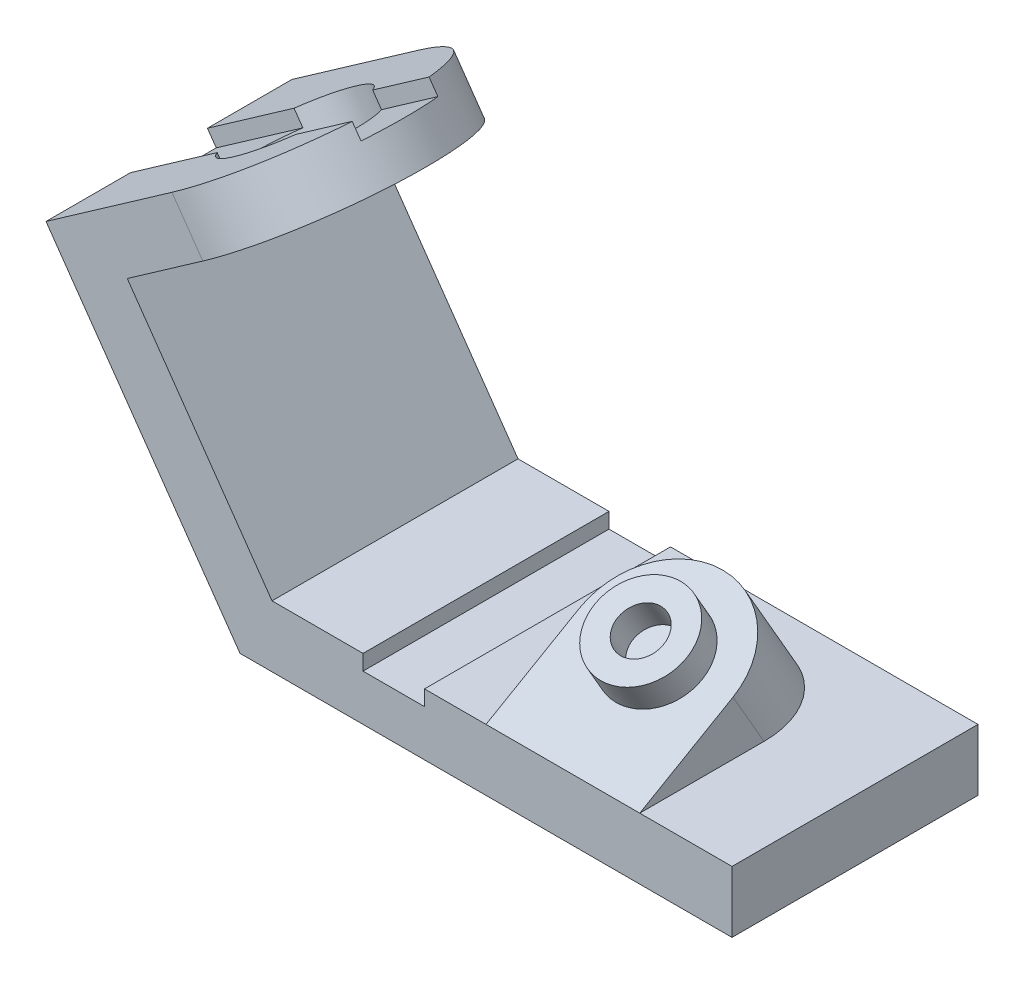
ISO-10303-21;
HEADER;
FILE_DESCRIPTION(('STEP AP214'),'2;1');
FILE_NAME('part.step','',(''),(''),'','','');
FILE_SCHEMA(('AUTOMOTIVE_DESIGN { 1 0 10303 214 1 1 1 1 }'));
ENDSEC;
DATA;
#1=APPLICATION_CONTEXT('core data for automotive mechanical design processes');
#2=APPLICATION_PROTOCOL_DEFINITION('international standard','automotive_design',2000,#1);
#3=PRODUCT_CONTEXT('',#1,'mechanical');
#4=PRODUCT('Part','Part','',(#3));
#5=PRODUCT_RELATED_PRODUCT_CATEGORY('part','',(#4));
#6=PRODUCT_DEFINITION_FORMATION('','',#4);
#7=PRODUCT_DEFINITION_CONTEXT('part definition',#1,'design');
#8=PRODUCT_DEFINITION('design','',#6,#7);
#9=PRODUCT_DEFINITION_SHAPE('','',#8);
#10=(LENGTH_UNIT() NAMED_UNIT(*) SI_UNIT(.MILLI.,.METRE.));
#11=(NAMED_UNIT(*) PLANE_ANGLE_UNIT() SI_UNIT($,.RADIAN.));
#12=(NAMED_UNIT(*) SI_UNIT($,.STERADIAN.) SOLID_ANGLE_UNIT());
#13=UNCERTAINTY_MEASURE_WITH_UNIT(LENGTH_MEASURE(1.E-05),#10,'distance_accuracy_value','');
#14=(GEOMETRIC_REPRESENTATION_CONTEXT(3) GLOBAL_UNCERTAINTY_ASSIGNED_CONTEXT((#13)) GLOBAL_UNIT_ASSIGNED_CONTEXT((#10,
#11,#12)) REPRESENTATION_CONTEXT('',''));
#15=CARTESIAN_POINT('',(0.,0.,0.));
#16=DIRECTION('',(0.,0.,1.));
#17=DIRECTION('',(1.,0.,0.));
#18=AXIS2_PLACEMENT_3D('',#15,#16,#17);
#19=CARTESIAN_POINT('',(-283.328628158242,114.435540587172,-101.6));
#20=DIRECTION('',(-0.57357643635105,0.819152044288989,0.));
#21=DIRECTION('',(-0.819152044288989,-0.57357643635105,0.));
#22=AXIS2_PLACEMENT_3D('',#19,#20,#21);
#23=PLANE('',#22);
#24=DIRECTION('',(-0.819152044288989,-0.57357643635105,0.));
#25=VECTOR('',#24,1.);
#26=CARTESIAN_POINT('',(-146.979381596355,209.90831085902,-66.675));
#27=LINE('',#26,#25);
#28=CARTESIAN_POINT('',(-191.783617952083,178.536046819009,-66.675));
#29=VERTEX_POINT('',#28);
#30=CARTESIAN_POINT('',(-215.070434211515,162.230442533251,-66.675));
#31=VERTEX_POINT('',#30);
#32=EDGE_CURVE('E206',#29,#31,#27,.T.);
#33=ORIENTED_EDGE('',*,*,#32,.F.);
#34=CARTESIAN_POINT('',(-231.312473345891,150.857644295464,-50.8));
#35=DIRECTION('',(-0.57357643635105,0.819152044288989,0.));
#36=DIRECTION('',(0.819152044288989,0.57357643635105,0.));
#37=AXIS2_PLACEMENT_3D('',#34,#35,#36);
#38=CIRCLE('',#37,50.8);
#39=CARTESIAN_POINT('',(-231.312473345891,150.857644295464,-101.6));
#40=VERTEX_POINT('',#39);
#41=EDGE_CURVE('E253',#29,#40,#38,.T.);
#42=ORIENTED_EDGE('',*,*,#41,.T.);
#43=DIRECTION('',(-0.819152044288989,-0.57357643635105,0.));
#44=VECTOR('',#43,1.);
#45=CARTESIAN_POINT('',(-283.328628158242,114.435540587172,-101.6));
#46=LINE('',#45,#44);
#47=CARTESIAN_POINT('',(-283.328628158242,114.435540587172,-101.6));
#48=VERTEX_POINT('',#47);
#49=EDGE_CURVE('E275',#40,#48,#46,.T.);
#50=ORIENTED_EDGE('',*,*,#49,.T.);
#51=DIRECTION('',(0.,0.,1.));
#52=VECTOR('',#51,1.);
#53=CARTESIAN_POINT('',(-283.328628158242,114.435540587172,-101.6));
#54=LINE('',#53,#52);
#55=CARTESIAN_POINT('',(-283.328628158242,114.435540587172,-66.675));
#56=VERTEX_POINT('',#55);
#57=EDGE_CURVE('E288',#48,#56,#54,.T.);
#58=ORIENTED_EDGE('',*,*,#57,.T.);
#59=DIRECTION('',(-0.819152044288989,-0.57357643635105,0.));
#60=VECTOR('',#59,1.);
#61=CARTESIAN_POINT('',(-146.979381596355,209.90831085902,-66.675));
#62=LINE('',#61,#60);
#63=CARTESIAN_POINT('',(-247.554512480267,139.484846057676,-66.675));
#64=VERTEX_POINT('',#63);
#65=EDGE_CURVE('E222',#64,#56,#62,.T.);
#66=ORIENTED_EDGE('',*,*,#65,.F.);
#67=CARTESIAN_POINT('',(-231.312473345891,150.857644295464,-50.8));
#68=DIRECTION('',(-0.57357643635105,0.819152044288989,0.));
#69=DIRECTION('',(-0.819152044288989,-0.57357643635105,0.));
#70=AXIS2_PLACEMENT_3D('',#67,#68,#69);
#71=CIRCLE('',#70,25.4);
#72=EDGE_CURVE('E249',#31,#64,#71,.T.);
#73=ORIENTED_EDGE('',*,*,#72,.F.);
#74=EDGE_LOOP('',(#33,#42,#50,#58,#66,#73));
#75=FACE_BOUND('',#74,.T.);
#76=ADVANCED_FACE('F36',(#75),#23,.T.);
#77=CARTESIAN_POINT('',(0.,25.4,-101.6));
#78=DIRECTION('',(0.,1.,0.));
#79=DIRECTION('',(-1.,0.,0.));
#80=AXIS2_PLACEMENT_3D('',#77,#78,#79);
#81=PLANE('',#80);
#82=DIRECTION('',(0.,0.,-1.));
#83=VECTOR('',#82,1.);
#84=CARTESIAN_POINT('',(-189.977596915986,25.4,-101.6));
#85=LINE('',#84,#83);
#86=CARTESIAN_POINT('',(-189.977596915986,25.4,0.));
#87=VERTEX_POINT('',#86);
#88=CARTESIAN_POINT('',(-189.977596915986,25.4,-101.6));
#89=VERTEX_POINT('',#88);
#90=EDGE_CURVE('E291',#87,#89,#85,.T.);
#91=ORIENTED_EDGE('',*,*,#90,.F.);
#92=DIRECTION('',(-1.,0.,0.));
#93=VECTOR('',#92,1.);
#94=CARTESIAN_POINT('',(0.,25.4,0.));
#95=LINE('',#94,#93);
#96=CARTESIAN_POINT('',(-152.4,25.4,0.));
#97=VERTEX_POINT('',#96);
#98=EDGE_CURVE('E365',#97,#87,#95,.T.);
#99=ORIENTED_EDGE('',*,*,#98,.F.);
#100=DIRECTION('',(0.,0.,1.));
#101=VECTOR('',#100,1.);
#102=CARTESIAN_POINT('',(-152.4,25.4,-101.6));
#103=LINE('',#102,#101);
#104=CARTESIAN_POINT('',(-152.4,25.4,-101.6));
#105=VERTEX_POINT('',#104);
#106=EDGE_CURVE('E341',#105,#97,#103,.T.);
#107=ORIENTED_EDGE('',*,*,#106,.F.);
#108=DIRECTION('',(-1.,0.,0.));
#109=VECTOR('',#108,1.);
#110=CARTESIAN_POINT('',(0.,25.4,-101.6));
#111=LINE('',#110,#109);
#112=EDGE_CURVE('E354',#105,#89,#111,.T.);
#113=ORIENTED_EDGE('',*,*,#112,.T.);
#114=EDGE_LOOP('',(#91,#99,#107,#113));
#115=FACE_BOUND('',#114,.T.);
#116=ADVANCED_FACE('F405',(#115),#81,.T.);
#117=DIRECTION('',(0.,0.,-1.));
#118=VECTOR('',#117,1.);
#119=CARTESIAN_POINT('',(-101.6,25.4,-25.4010000000001));
#120=LINE('',#119,#118);
#121=CARTESIAN_POINT('',(-101.6,25.4,0.));
#122=VERTEX_POINT('',#121);
#123=CARTESIAN_POINT('',(-101.6,25.4,-51.3264389309578));
#124=VERTEX_POINT('',#123);
#125=EDGE_CURVE('E317',#122,#124,#120,.T.);
#126=ORIENTED_EDGE('',*,*,#125,.T.);
#127=CARTESIAN_POINT('',(-69.85,25.4,-51.3264389309578));
#128=DIRECTION('',(0.,1.,0.));
#129=DIRECTION('',(0.,0.,1.));
#130=AXIS2_PLACEMENT_3D('',#127,#128,#129);
#131=ELLIPSE('',#130,36.6617420935412,31.75);
#132=CARTESIAN_POINT('',(-38.1,25.4,-51.3264389309578));
#133=VERTEX_POINT('',#132);
#134=EDGE_CURVE('E321',#124,#133,#131,.F.);
#135=ORIENTED_EDGE('',*,*,#134,.T.);
#136=DIRECTION('',(0.,0.,1.));
#137=VECTOR('',#136,1.);
#138=CARTESIAN_POINT('',(-38.1,25.4,-25.4010000000001));
#139=LINE('',#138,#137);
#140=CARTESIAN_POINT('',(-38.1,25.4,0.));
#141=VERTEX_POINT('',#140);
#142=EDGE_CURVE('E316',#133,#141,#139,.T.);
#143=ORIENTED_EDGE('',*,*,#142,.T.);
#144=CARTESIAN_POINT('',(0.,25.4,0.));
#145=VERTEX_POINT('',#144);
#146=EDGE_CURVE('E366',#145,#141,#95,.T.);
#147=ORIENTED_EDGE('',*,*,#146,.F.);
#148=DIRECTION('',(0.,0.,1.));
#149=VECTOR('',#148,1.);
#150=CARTESIAN_POINT('',(0.,25.4,-101.6));
#151=LINE('',#150,#149);
#152=CARTESIAN_POINT('',(0.,25.4,-101.6));
#153=VERTEX_POINT('',#152);
#154=EDGE_CURVE('E362',#153,#145,#151,.T.);
#155=ORIENTED_EDGE('',*,*,#154,.F.);
#156=CARTESIAN_POINT('',(-127.,25.4,-101.6));
#157=VERTEX_POINT('',#156);
#158=EDGE_CURVE('E356',#153,#157,#111,.T.);
#159=ORIENTED_EDGE('',*,*,#158,.T.);
#160=DIRECTION('',(0.,0.,1.));
#161=VECTOR('',#160,1.);
#162=CARTESIAN_POINT('',(-127.,25.4,-101.6));
#163=LINE('',#162,#161);
#164=CARTESIAN_POINT('',(-127.,25.4,0.));
#165=VERTEX_POINT('',#164);
#166=EDGE_CURVE('E344',#157,#165,#163,.T.);
#167=ORIENTED_EDGE('',*,*,#166,.T.);
#168=EDGE_CURVE('E369',#122,#165,#95,.T.);
#169=ORIENTED_EDGE('',*,*,#168,.F.);
#170=EDGE_LOOP('',(#126,#135,#143,#147,#155,#159,#167,#169));
#171=FACE_BOUND('',#170,.T.);
#172=ADVANCED_FACE('F411',(#171),#81,.T.);
#173=CARTESIAN_POINT('',(0.,0.,-101.6));
#174=DIRECTION('',(0.,0.,1.));
#175=DIRECTION('',(1.,0.,0.));
#176=AXIS2_PLACEMENT_3D('',#173,#174,#175);
#177=PLANE('',#176);
#178=DIRECTION('',(1.,0.,0.));
#179=VECTOR('',#178,1.);
#180=CARTESIAN_POINT('',(0.,0.,-101.6));
#181=LINE('',#180,#179);
#182=CARTESIAN_POINT('',(-203.2,0.,-101.6));
#183=VERTEX_POINT('',#182);
#184=CARTESIAN_POINT('',(0.,0.,-101.6));
#185=VERTEX_POINT('',#184);
#186=EDGE_CURVE('E359',#183,#185,#181,.T.);
#187=ORIENTED_EDGE('',*,*,#186,.F.);
#188=DIRECTION('',(0.57357643635105,-0.819152044288989,0.));
#189=VECTOR('',#188,1.);
#190=CARTESIAN_POINT('',(-203.2,0.,-101.6));
#191=LINE('',#190,#189);
#192=EDGE_CURVE('E279',#48,#183,#191,.T.);
#193=ORIENTED_EDGE('',*,*,#192,.F.);
#194=ORIENTED_EDGE('',*,*,#49,.F.);
#195=DIRECTION('',(-0.57357643635105,0.819152044288989,0.));
#196=VECTOR('',#195,1.);
#197=CARTESIAN_POINT('',(-218.564737047989,132.651990111141,-101.6));
#198=LINE('',#197,#196);
#199=CARTESIAN_POINT('',(-218.564737047989,132.651990111141,-101.6));
#200=VERTEX_POINT('',#199);
#201=EDGE_CURVE('E267',#200,#40,#198,.T.);
#202=ORIENTED_EDGE('',*,*,#201,.F.);
#203=DIRECTION('',(-0.819152044288989,-0.57357643635105,0.));
#204=VECTOR('',#203,1.);
#205=CARTESIAN_POINT('',(-270.58089186034,96.229886402849,-101.6));
#206=LINE('',#205,#204);
#207=CARTESIAN_POINT('',(-249.774429935399,110.798727886166,-101.6));
#208=VERTEX_POINT('',#207);
#209=EDGE_CURVE('E261',#200,#208,#206,.T.);
#210=ORIENTED_EDGE('',*,*,#209,.T.);
#211=DIRECTION('',(-0.57357643635105,0.819152044288989,0.));
#212=VECTOR('',#211,1.);
#213=CARTESIAN_POINT('',(-262.522166233301,129.004382070488,-101.6));
#214=LINE('',#213,#212);
#215=EDGE_CURVE('E273',#89,#208,#214,.T.);
#216=ORIENTED_EDGE('',*,*,#215,.F.);
#217=ORIENTED_EDGE('',*,*,#112,.F.);
#218=DIRECTION('',(0.,1.,0.));
#219=VECTOR('',#218,1.);
#220=CARTESIAN_POINT('',(-152.4,0.,-101.6));
#221=LINE('',#220,#219);
#222=CARTESIAN_POINT('',(-152.4,19.05,-101.6));
#223=VERTEX_POINT('',#222);
#224=EDGE_CURVE('E326',#223,#105,#221,.T.);
#225=ORIENTED_EDGE('',*,*,#224,.F.);
#226=DIRECTION('',(-1.,0.,0.));
#227=VECTOR('',#226,1.);
#228=CARTESIAN_POINT('',(0.,19.05,-101.6));
#229=LINE('',#228,#227);
#230=CARTESIAN_POINT('',(-127.,19.05,-101.6));
#231=VERTEX_POINT('',#230);
#232=EDGE_CURVE('E328',#231,#223,#229,.T.);
#233=ORIENTED_EDGE('',*,*,#232,.F.);
#234=DIRECTION('',(0.,-1.,0.));
#235=VECTOR('',#234,1.);
#236=CARTESIAN_POINT('',(-127.,0.,-101.6));
#237=LINE('',#236,#235);
#238=EDGE_CURVE('E331',#157,#231,#237,.T.);
#239=ORIENTED_EDGE('',*,*,#238,.F.);
#240=ORIENTED_EDGE('',*,*,#158,.F.);
#241=DIRECTION('',(0.,1.,0.));
#242=VECTOR('',#241,1.);
#243=CARTESIAN_POINT('',(0.,0.,-101.6));
#244=LINE('',#243,#242);
#245=EDGE_CURVE('E351',#185,#153,#244,.T.);
#246=ORIENTED_EDGE('',*,*,#245,.F.);
#247=EDGE_LOOP('',(#187,#193,#194,#202,#210,#216,#217,#225,#233,#239,#240,#246));
#248=FACE_BOUND('',#247,.T.);
#249=ADVANCED_FACE('F443',(#248),#177,.F.);
#250=CARTESIAN_POINT('',(0.,0.,0.));
#251=DIRECTION('',(0.,0.,1.));
#252=DIRECTION('',(1.,0.,0.));
#253=AXIS2_PLACEMENT_3D('',#250,#251,#252);
#254=PLANE('',#253);
#255=DIRECTION('',(-0.57357643635105,0.819152044288989,0.));
#256=VECTOR('',#255,1.);
#257=CARTESIAN_POINT('',(-262.522166233301,129.004382070488,0.));
#258=LINE('',#257,#256);
#259=CARTESIAN_POINT('',(-249.774429935399,110.798727886166,0.));
#260=VERTEX_POINT('',#259);
#261=EDGE_CURVE('E270',#87,#260,#258,.T.);
#262=ORIENTED_EDGE('',*,*,#261,.T.);
#263=DIRECTION('',(0.819152044288989,0.57357643635105,0.));
#264=VECTOR('',#263,1.);
#265=CARTESIAN_POINT('',(-270.58089186034,96.229886402849,0.));
#266=LINE('',#265,#264);
#267=CARTESIAN_POINT('',(-218.564737047989,132.651990111141,0.));
#268=VERTEX_POINT('',#267);
#269=EDGE_CURVE('E255',#260,#268,#266,.T.);
#270=ORIENTED_EDGE('',*,*,#269,.T.);
#271=DIRECTION('',(-0.57357643635105,0.819152044288989,0.));
#272=VECTOR('',#271,1.);
#273=CARTESIAN_POINT('',(-218.564737047989,132.651990111141,0.));
#274=LINE('',#273,#272);
#275=CARTESIAN_POINT('',(-231.312473345891,150.857644295464,0.));
#276=VERTEX_POINT('',#275);
#277=EDGE_CURVE('E264',#268,#276,#274,.T.);
#278=ORIENTED_EDGE('',*,*,#277,.T.);
#279=DIRECTION('',(-0.819152044288989,-0.57357643635105,0.));
#280=VECTOR('',#279,1.);
#281=CARTESIAN_POINT('',(-283.328628158242,114.435540587172,0.));
#282=LINE('',#281,#280);
#283=CARTESIAN_POINT('',(-283.328628158242,114.435540587172,0.));
#284=VERTEX_POINT('',#283);
#285=EDGE_CURVE('E284',#276,#284,#282,.T.);
#286=ORIENTED_EDGE('',*,*,#285,.T.);
#287=DIRECTION('',(0.57357643635105,-0.819152044288989,0.));
#288=VECTOR('',#287,1.);
#289=CARTESIAN_POINT('',(-203.2,0.,0.));
#290=LINE('',#289,#288);
#291=CARTESIAN_POINT('',(-203.2,0.,0.));
#292=VERTEX_POINT('',#291);
#293=EDGE_CURVE('E276',#284,#292,#290,.T.);
#294=ORIENTED_EDGE('',*,*,#293,.T.);
#295=DIRECTION('',(1.,0.,0.));
#296=VECTOR('',#295,1.);
#297=CARTESIAN_POINT('',(0.,0.,0.));
#298=LINE('',#297,#296);
#299=CARTESIAN_POINT('',(0.,0.,0.));
#300=VERTEX_POINT('',#299);
#301=EDGE_CURVE('E355',#292,#300,#298,.T.);
#302=ORIENTED_EDGE('',*,*,#301,.T.);
#303=DIRECTION('',(0.,1.,0.));
#304=VECTOR('',#303,1.);
#305=CARTESIAN_POINT('',(0.,0.,0.));
#306=LINE('',#305,#304);
#307=EDGE_CURVE('E343',#300,#145,#306,.T.);
#308=ORIENTED_EDGE('',*,*,#307,.T.);
#309=ORIENTED_EDGE('',*,*,#146,.T.);
#310=DIRECTION('',(1.,0.,0.));
#311=VECTOR('',#310,1.);
#312=CARTESIAN_POINT('',(0.,25.4,0.));
#313=LINE('',#312,#311);
#314=EDGE_CURVE('E310',#122,#141,#313,.T.);
#315=ORIENTED_EDGE('',*,*,#314,.F.);
#316=ORIENTED_EDGE('',*,*,#168,.T.);
#317=DIRECTION('',(0.,-1.,0.));
#318=VECTOR('',#317,1.);
#319=CARTESIAN_POINT('',(-127.,0.,0.));
#320=LINE('',#319,#318);
#321=CARTESIAN_POINT('',(-127.,19.05,0.));
#322=VERTEX_POINT('',#321);
#323=EDGE_CURVE('E329',#165,#322,#320,.T.);
#324=ORIENTED_EDGE('',*,*,#323,.T.);
#325=DIRECTION('',(-1.,0.,0.));
#326=VECTOR('',#325,1.);
#327=CARTESIAN_POINT('',(0.,19.05,0.));
#328=LINE('',#327,#326);
#329=CARTESIAN_POINT('',(-152.4,19.05,0.));
#330=VERTEX_POINT('',#329);
#331=EDGE_CURVE('E336',#322,#330,#328,.T.);
#332=ORIENTED_EDGE('',*,*,#331,.T.);
#333=DIRECTION('',(0.,1.,0.));
#334=VECTOR('',#333,1.);
#335=CARTESIAN_POINT('',(-152.4,0.,0.));
#336=LINE('',#335,#334);
#337=EDGE_CURVE('E320',#330,#97,#336,.T.);
#338=ORIENTED_EDGE('',*,*,#337,.T.);
#339=ORIENTED_EDGE('',*,*,#98,.T.);
#340=EDGE_LOOP('',(#262,#270,#278,#286,#294,#302,#308,#309,#315,#316,#324,#332,#338,#339));
#341=FACE_BOUND('',#340,.T.);
#342=ADVANCED_FACE('F461',(#341),#254,.T.);
#343=CARTESIAN_POINT('',(0.,0.,-101.6));
#344=DIRECTION('',(1.,0.,0.));
#345=DIRECTION('',(0.,0.,-1.));
#346=AXIS2_PLACEMENT_3D('',#343,#344,#345);
#347=PLANE('',#346);
#348=ORIENTED_EDGE('',*,*,#307,.F.);
#349=DIRECTION('',(0.,0.,1.));
#350=VECTOR('',#349,1.);
#351=CARTESIAN_POINT('',(0.,0.,-101.6));
#352=LINE('',#351,#350);
#353=EDGE_CURVE('E372',#185,#300,#352,.T.);
#354=ORIENTED_EDGE('',*,*,#353,.F.);
#355=ORIENTED_EDGE('',*,*,#245,.T.);
#356=ORIENTED_EDGE('',*,*,#154,.T.);
#357=EDGE_LOOP('',(#348,#354,#355,#356));
#358=FACE_BOUND('',#357,.T.);
#359=ADVANCED_FACE('F38',(#358),#347,.T.);
#360=CARTESIAN_POINT('',(0.,0.,-101.6));
#361=DIRECTION('',(0.,-1.,0.));
#362=DIRECTION('',(0.,0.,-1.));
#363=AXIS2_PLACEMENT_3D('',#360,#361,#362);
#364=PLANE('',#363);
#365=ORIENTED_EDGE('',*,*,#301,.F.);
#366=DIRECTION('',(0.,0.,1.));
#367=VECTOR('',#366,1.);
#368=CARTESIAN_POINT('',(-203.2,0.,-101.6));
#369=LINE('',#368,#367);
#370=EDGE_CURVE('E374',#183,#292,#369,.T.);
#371=ORIENTED_EDGE('',*,*,#370,.F.);
#372=ORIENTED_EDGE('',*,*,#186,.T.);
#373=ORIENTED_EDGE('',*,*,#353,.T.);
#374=EDGE_LOOP('',(#365,#371,#372,#373));
#375=FACE_BOUND('',#374,.T.);
#376=ADVANCED_FACE('F485',(#375),#364,.T.);
#377=CARTESIAN_POINT('',(-152.4,0.,-101.6));
#378=DIRECTION('',(1.,0.,0.));
#379=DIRECTION('',(0.,0.,-1.));
#380=AXIS2_PLACEMENT_3D('',#377,#378,#379);
#381=PLANE('',#380);
#382=ORIENTED_EDGE('',*,*,#337,.F.);
#383=DIRECTION('',(0.,0.,1.));
#384=VECTOR('',#383,1.);
#385=CARTESIAN_POINT('',(-152.4,19.05,-101.6));
#386=LINE('',#385,#384);
#387=EDGE_CURVE('E333',#223,#330,#386,.T.);
#388=ORIENTED_EDGE('',*,*,#387,.F.);
#389=ORIENTED_EDGE('',*,*,#224,.T.);
#390=ORIENTED_EDGE('',*,*,#106,.T.);
#391=EDGE_LOOP('',(#382,#388,#389,#390));
#392=FACE_BOUND('',#391,.T.);
#393=ADVANCED_FACE('F487',(#392),#381,.T.);
#394=CARTESIAN_POINT('',(-127.,0.,-101.6));
#395=DIRECTION('',(-1.,0.,0.));
#396=DIRECTION('',(0.,0.,1.));
#397=AXIS2_PLACEMENT_3D('',#394,#395,#396);
#398=PLANE('',#397);
#399=ORIENTED_EDGE('',*,*,#323,.F.);
#400=ORIENTED_EDGE('',*,*,#166,.F.);
#401=ORIENTED_EDGE('',*,*,#238,.T.);
#402=DIRECTION('',(0.,0.,1.));
#403=VECTOR('',#402,1.);
#404=CARTESIAN_POINT('',(-127.,19.05,-101.6));
#405=LINE('',#404,#403);
#406=EDGE_CURVE('E347',#231,#322,#405,.T.);
#407=ORIENTED_EDGE('',*,*,#406,.T.);
#408=EDGE_LOOP('',(#399,#400,#401,#407));
#409=FACE_BOUND('',#408,.T.);
#410=ADVANCED_FACE('F474',(#409),#398,.T.);
#411=CARTESIAN_POINT('',(0.,19.05,-101.6));
#412=DIRECTION('',(0.,1.,0.));
#413=DIRECTION('',(-1.,0.,0.));
#414=AXIS2_PLACEMENT_3D('',#411,#412,#413);
#415=PLANE('',#414);
#416=ORIENTED_EDGE('',*,*,#331,.F.);
#417=ORIENTED_EDGE('',*,*,#406,.F.);
#418=ORIENTED_EDGE('',*,*,#232,.T.);
#419=ORIENTED_EDGE('',*,*,#387,.T.);
#420=EDGE_LOOP('',(#416,#417,#418,#419));
#421=FACE_BOUND('',#420,.T.);
#422=ADVANCED_FACE('F403',(#421),#415,.T.);
#423=CARTESIAN_POINT('',(-101.6,-43.9958225630571,-25.4010000000001));
#424=DIRECTION('',(-1.,0.,0.));
#425=DIRECTION('',(0.,0.,1.));
#426=AXIS2_PLACEMENT_3D('',#423,#424,#425);
#427=PLANE('',#426);
#428=ORIENTED_EDGE('',*,*,#125,.F.);
#429=DIRECTION('',(0.,-0.500000000000001,0.866025403784438));
#430=VECTOR('',#429,1.);
#431=CARTESIAN_POINT('',(-101.6,19.05,10.9985226280624));
#432=LINE('',#431,#430);
#433=CARTESIAN_POINT('',(-101.6,47.625,-38.4948291982183));
#434=VERTEX_POINT('',#433);
#435=EDGE_CURVE('E308',#434,#122,#432,.T.);
#436=ORIENTED_EDGE('',*,*,#435,.F.);
#437=DIRECTION('',(0.,0.866025403784438,0.500000000000001));
#438=VECTOR('',#437,1.);
#439=CARTESIAN_POINT('',(-101.6,-15.420822563057,-74.8943518262808));
#440=LINE('',#439,#438);
#441=EDGE_CURVE('E312',#124,#434,#440,.T.);
#442=ORIENTED_EDGE('',*,*,#441,.F.);
#443=EDGE_LOOP('',(#428,#436,#442));
#444=FACE_BOUND('',#443,.T.);
#445=ADVANCED_FACE('F502',(#444),#427,.T.);
#446=CARTESIAN_POINT('',(-69.85,-15.420822563057,-74.8943518262808));
#447=DIRECTION('',(0.,0.866025403784438,0.500000000000001));
#448=DIRECTION('',(0.,-0.500000000000001,0.866025403784438));
#449=AXIS2_PLACEMENT_3D('',#446,#447,#448);
#450=CYLINDRICAL_SURFACE('',#449,31.75);
#451=ORIENTED_EDGE('',*,*,#134,.F.);
#452=ORIENTED_EDGE('',*,*,#441,.T.);
#453=CARTESIAN_POINT('',(-69.85,47.6250000000001,-38.4948291982183));
#454=DIRECTION('',(0.,0.866025403784438,0.500000000000001));
#455=DIRECTION('',(0.,-0.500000000000001,0.866025403784438));
#456=AXIS2_PLACEMENT_3D('',#453,#454,#455);
#457=CIRCLE('',#456,31.75);
#458=CARTESIAN_POINT('',(-38.1,47.6250000000001,-38.4948291982183));
#459=VERTEX_POINT('',#458);
#460=EDGE_CURVE('E305',#459,#434,#457,.T.);
#461=ORIENTED_EDGE('',*,*,#460,.F.);
#462=DIRECTION('',(0.,0.866025403784438,0.500000000000001));
#463=VECTOR('',#462,1.);
#464=CARTESIAN_POINT('',(-38.1,-15.420822563057,-74.8943518262808));
#465=LINE('',#464,#463);
#466=EDGE_CURVE('E314',#133,#459,#465,.T.);
#467=ORIENTED_EDGE('',*,*,#466,.F.);
#468=EDGE_LOOP('',(#451,#452,#461,#467));
#469=FACE_BOUND('',#468,.T.);
#470=ADVANCED_FACE('F508',(#469),#450,.T.);
#471=CARTESIAN_POINT('',(-38.1,-43.9958225630571,-25.4010000000001));
#472=DIRECTION('',(1.,0.,0.));
#473=DIRECTION('',(0.,1.,0.));
#474=AXIS2_PLACEMENT_3D('',#471,#472,#473);
#475=PLANE('',#474);
#476=ORIENTED_EDGE('',*,*,#142,.F.);
#477=ORIENTED_EDGE('',*,*,#466,.T.);
#478=DIRECTION('',(0.,0.500000000000001,-0.866025403784438));
#479=VECTOR('',#478,1.);
#480=CARTESIAN_POINT('',(-38.1,19.05,10.9985226280624));
#481=LINE('',#480,#479);
#482=EDGE_CURVE('E300',#141,#459,#481,.T.);
#483=ORIENTED_EDGE('',*,*,#482,.F.);
#484=EDGE_LOOP('',(#476,#477,#483));
#485=FACE_BOUND('',#484,.T.);
#486=ADVANCED_FACE('F401',(#485),#475,.T.);
#487=CARTESIAN_POINT('',(0.,19.05,10.9985226280624));
#488=DIRECTION('',(0.,0.866025403784438,0.500000000000001));
#489=DIRECTION('',(0.,-0.500000000000001,0.866025403784438));
#490=AXIS2_PLACEMENT_3D('',#487,#488,#489);
#491=PLANE('',#490);
#492=CARTESIAN_POINT('',(-69.85,47.6250000000001,-38.4948291982183));
#493=DIRECTION('',(0.,0.866025403784438,0.500000000000001));
#494=DIRECTION('',(0.,-0.500000000000001,0.866025403784438));
#495=AXIS2_PLACEMENT_3D('',#492,#493,#494);
#496=CIRCLE('',#495,19.05);
#497=CARTESIAN_POINT('',(-69.85,38.1000000000001,-21.9970452561247));
#498=VERTEX_POINT('',#497);
#499=EDGE_CURVE('E296',#498,#498,#496,.T.);
#500=ORIENTED_EDGE('',*,*,#499,.F.);
#501=EDGE_LOOP('',(#500));
#502=FACE_BOUND('',#501,.T.);
#503=ORIENTED_EDGE('',*,*,#482,.T.);
#504=ORIENTED_EDGE('',*,*,#460,.T.);
#505=ORIENTED_EDGE('',*,*,#435,.T.);
#506=ORIENTED_EDGE('',*,*,#314,.T.);
#507=EDGE_LOOP('',(#503,#504,#505,#506));
#508=FACE_BOUND('',#507,.T.);
#509=ADVANCED_FACE('F386',(#502,#508),#491,.T.);
#510=CARTESIAN_POINT('',(-69.85,58.6235226280624,-32.1448291982183));
#511=DIRECTION('',(0.,0.866025403784438,0.500000000000001));
#512=DIRECTION('',(0.,-0.500000000000001,0.866025403784438));
#513=AXIS2_PLACEMENT_3D('',#510,#511,#512);
#514=PLANE('',#513);
#515=CARTESIAN_POINT('',(-69.85,58.6235226280624,-32.1448291982183));
#516=DIRECTION('',(0.,0.866025403784438,0.500000000000001));
#517=DIRECTION('',(0.,-0.500000000000001,0.866025403784438));
#518=AXIS2_PLACEMENT_3D('',#515,#516,#517);
#519=CIRCLE('',#518,19.05);
#520=CARTESIAN_POINT('',(-69.85,49.0985226280624,-15.6470452561247));
#521=VERTEX_POINT('',#520);
#522=EDGE_CURVE('E297',#521,#521,#519,.T.);
#523=ORIENTED_EDGE('',*,*,#522,.T.);
#524=EDGE_LOOP('',(#523));
#525=FACE_BOUND('',#524,.T.);
#526=CARTESIAN_POINT('',(-69.85,58.6235226280624,-32.1448291982183));
#527=DIRECTION('',(0.,0.866025403784438,0.500000000000001));
#528=DIRECTION('',(0.,-0.500000000000001,0.866025403784438));
#529=AXIS2_PLACEMENT_3D('',#526,#527,#528);
#530=CIRCLE('',#529,9.525);
#531=CARTESIAN_POINT('',(-69.85,53.8610226280624,-23.8959372271715));
#532=VERTEX_POINT('',#531);
#533=EDGE_CURVE('E293',#532,#532,#530,.T.);
#534=ORIENTED_EDGE('',*,*,#533,.F.);
#535=EDGE_LOOP('',(#534));
#536=FACE_BOUND('',#535,.T.);
#537=ADVANCED_FACE('F400',(#525,#536),#514,.T.);
#538=CARTESIAN_POINT('',(-69.85,58.6235226280624,-32.1448291982183));
#539=DIRECTION('',(0.,-0.866025403784438,-0.500000000000001));
#540=DIRECTION('',(0.,0.500000000000001,-0.866025403784438));
#541=AXIS2_PLACEMENT_3D('',#538,#539,#540);
#542=CYLINDRICAL_SURFACE('',#541,19.05);
#543=ORIENTED_EDGE('',*,*,#522,.F.);
#544=EDGE_LOOP('',(#543));
#545=FACE_BOUND('',#544,.T.);
#546=ORIENTED_EDGE('',*,*,#499,.T.);
#547=EDGE_LOOP('',(#546));
#548=FACE_BOUND('',#547,.T.);
#549=ADVANCED_FACE('F394',(#545,#548),#542,.T.);
#550=CARTESIAN_POINT('',(-69.85,58.6235226280624,-32.1448291982183));
#551=DIRECTION('',(0.,-0.866025403784438,-0.500000000000001));
#552=DIRECTION('',(0.,0.500000000000001,-0.866025403784438));
#553=AXIS2_PLACEMENT_3D('',#550,#551,#552);
#554=CYLINDRICAL_SURFACE('',#553,9.525);
#555=ORIENTED_EDGE('',*,*,#533,.T.);
#556=EDGE_LOOP('',(#555));
#557=FACE_BOUND('',#556,.T.);
#558=CARTESIAN_POINT('',(-69.85,47.6250000000001,-38.4948291982183));
#559=DIRECTION('',(0.,0.866025403784438,0.500000000000001));
#560=DIRECTION('',(0.,-0.500000000000001,0.866025403784438));
#561=AXIS2_PLACEMENT_3D('',#558,#559,#560);
#562=CIRCLE('',#561,9.525);
#563=CARTESIAN_POINT('',(-69.85,42.8625,-30.2459372271715));
#564=VERTEX_POINT('',#563);
#565=EDGE_CURVE('E44',#564,#564,#562,.F.);
#566=ORIENTED_EDGE('',*,*,#565,.T.);
#567=EDGE_LOOP('',(#566));
#568=FACE_BOUND('',#567,.T.);
#569=ADVANCED_FACE('F380',(#557,#568),#554,.F.);
#570=ORIENTED_EDGE('',*,*,#565,.F.);
#571=EDGE_LOOP('',(#570));
#572=FACE_BOUND('',#571,.T.);
#573=ADVANCED_FACE('F382',(#572),#491,.T.);
#574=CARTESIAN_POINT('',(-203.2,0.,-101.6));
#575=DIRECTION('',(-0.819152044288989,-0.57357643635105,0.));
#576=DIRECTION('',(0.57357643635105,-0.819152044288989,0.));
#577=AXIS2_PLACEMENT_3D('',#574,#575,#576);
#578=PLANE('',#577);
#579=DIRECTION('',(-0.57357643635105,0.819152044288989,0.));
#580=VECTOR('',#579,1.);
#581=CARTESIAN_POINT('',(-279.686417787413,109.233925105937,-66.675));
#582=LINE('',#581,#580);
#583=CARTESIAN_POINT('',(-279.686417787413,109.233925105937,-66.675));
#584=VERTEX_POINT('',#583);
#585=EDGE_CURVE('E233',#584,#56,#582,.T.);
#586=ORIENTED_EDGE('',*,*,#585,.T.);
#587=ORIENTED_EDGE('',*,*,#57,.F.);
#588=ORIENTED_EDGE('',*,*,#192,.T.);
#589=ORIENTED_EDGE('',*,*,#370,.T.);
#590=ORIENTED_EDGE('',*,*,#293,.F.);
#591=CARTESIAN_POINT('',(-283.328628158242,114.435540587172,-34.925));
#592=VERTEX_POINT('',#591);
#593=EDGE_CURVE('E281',#592,#284,#54,.T.);
#594=ORIENTED_EDGE('',*,*,#593,.F.);
#595=DIRECTION('',(-0.57357643635105,0.819152044288989,0.));
#596=VECTOR('',#595,1.);
#597=CARTESIAN_POINT('',(-279.686417787413,109.233925105937,-34.925));
#598=LINE('',#597,#596);
#599=CARTESIAN_POINT('',(-279.686417787413,109.233925105937,-34.925));
#600=VERTEX_POINT('',#599);
#601=EDGE_CURVE('E229',#600,#592,#598,.T.);
#602=ORIENTED_EDGE('',*,*,#601,.F.);
#603=DIRECTION('',(0.,0.,1.));
#604=VECTOR('',#603,1.);
#605=CARTESIAN_POINT('',(-279.686417787413,109.233925105937,0.));
#606=LINE('',#605,#604);
#607=EDGE_CURVE('E220',#584,#600,#606,.T.);
#608=ORIENTED_EDGE('',*,*,#607,.F.);
#609=EDGE_LOOP('',(#586,#587,#588,#589,#590,#594,#602,#608));
#610=FACE_BOUND('',#609,.T.);
#611=ADVANCED_FACE('F384',(#610),#578,.T.);
#612=DIRECTION('',(0.819152044288989,0.57357643635105,0.));
#613=VECTOR('',#612,1.);
#614=CARTESIAN_POINT('',(-146.979381596355,209.90831085902,-34.925));
#615=LINE('',#614,#613);
#616=CARTESIAN_POINT('',(-215.070434211515,162.230442533251,-34.925));
#617=VERTEX_POINT('',#616);
#618=CARTESIAN_POINT('',(-191.783617952083,178.536046819009,-34.925));
#619=VERTEX_POINT('',#618);
#620=EDGE_CURVE('E236',#617,#619,#615,.T.);
#621=ORIENTED_EDGE('',*,*,#620,.F.);
#622=CARTESIAN_POINT('',(-247.554512480267,139.484846057676,-34.925));
#623=VERTEX_POINT('',#622);
#624=EDGE_CURVE('E213',#623,#617,#71,.T.);
#625=ORIENTED_EDGE('',*,*,#624,.F.);
#626=DIRECTION('',(0.819152044288989,0.57357643635105,0.));
#627=VECTOR('',#626,1.);
#628=CARTESIAN_POINT('',(-146.979381596355,209.90831085902,-34.925));
#629=LINE('',#628,#627);
#630=EDGE_CURVE('E230',#592,#623,#629,.T.);
#631=ORIENTED_EDGE('',*,*,#630,.F.);
#632=ORIENTED_EDGE('',*,*,#593,.T.);
#633=ORIENTED_EDGE('',*,*,#285,.F.);
#634=EDGE_CURVE('E258',#276,#619,#38,.T.);
#635=ORIENTED_EDGE('',*,*,#634,.T.);
#636=EDGE_LOOP('',(#621,#625,#631,#632,#633,#635));
#637=FACE_BOUND('',#636,.T.);
#638=ADVANCED_FACE('F391',(#637),#23,.T.);
#639=CARTESIAN_POINT('',(-262.522166233301,129.004382070488,-101.6));
#640=DIRECTION('',(0.819152044288989,0.57357643635105,0.));
#641=DIRECTION('',(-0.57357643635105,0.819152044288989,0.));
#642=AXIS2_PLACEMENT_3D('',#639,#640,#641);
#643=PLANE('',#642);
#644=DIRECTION('',(0.,0.,-1.));
#645=VECTOR('',#644,1.);
#646=CARTESIAN_POINT('',(-249.774429935399,110.798727886166,-101.6));
#647=LINE('',#646,#645);
#648=EDGE_CURVE('E11',#260,#208,#647,.T.);
#649=ORIENTED_EDGE('',*,*,#648,.F.);
#650=ORIENTED_EDGE('',*,*,#261,.F.);
#651=ORIENTED_EDGE('',*,*,#90,.T.);
#652=ORIENTED_EDGE('',*,*,#215,.T.);
#653=EDGE_LOOP('',(#649,#650,#651,#652));
#654=FACE_BOUND('',#653,.T.);
#655=ADVANCED_FACE('F416',(#654),#643,.T.);
#656=CARTESIAN_POINT('',(-218.564737047989,132.651990111141,-50.8));
#657=DIRECTION('',(-0.57357643635105,0.819152044288989,0.));
#658=DIRECTION('',(-0.819152044288989,-0.57357643635105,0.));
#659=AXIS2_PLACEMENT_3D('',#656,#657,#658);
#660=CYLINDRICAL_SURFACE('',#659,50.8);
#661=DIRECTION('',(-0.57357643635105,0.819152044288989,0.));
#662=VECTOR('',#661,1.);
#663=CARTESIAN_POINT('',(-188.141407581254,173.334431337774,-66.675));
#664=LINE('',#663,#662);
#665=CARTESIAN_POINT('',(-188.141407581254,173.334431337774,-66.675));
#666=VERTEX_POINT('',#665);
#667=EDGE_CURVE('E215',#666,#29,#664,.T.);
#668=ORIENTED_EDGE('',*,*,#667,.F.);
#669=CARTESIAN_POINT('',(-227.670262975062,145.656028814228,-50.8));
#670=DIRECTION('',(-0.57357643635105,0.819152044288989,0.));
#671=DIRECTION('',(-0.819152044288989,-0.57357643635105,0.));
#672=AXIS2_PLACEMENT_3D('',#669,#670,#671);
#673=CIRCLE('',#672,50.8);
#674=CARTESIAN_POINT('',(-188.141407581254,173.334431337774,-34.925));
#675=VERTEX_POINT('',#674);
#676=EDGE_CURVE('E199',#675,#666,#673,.T.);
#677=ORIENTED_EDGE('',*,*,#676,.F.);
#678=DIRECTION('',(-0.57357643635105,0.819152044288989,0.));
#679=VECTOR('',#678,1.);
#680=CARTESIAN_POINT('',(-188.141407581254,173.334431337774,-34.925));
#681=LINE('',#680,#679);
#682=EDGE_CURVE('E197',#675,#619,#681,.T.);
#683=ORIENTED_EDGE('',*,*,#682,.T.);
#684=ORIENTED_EDGE('',*,*,#634,.F.);
#685=ORIENTED_EDGE('',*,*,#277,.F.);
#686=CARTESIAN_POINT('',(-218.564737047989,132.651990111141,-50.8));
#687=DIRECTION('',(-0.57357643635105,0.819152044288989,0.));
#688=DIRECTION('',(0.819152044288989,0.57357643635105,0.));
#689=AXIS2_PLACEMENT_3D('',#686,#687,#688);
#690=CIRCLE('',#689,50.8);
#691=EDGE_CURVE('E257',#268,#200,#690,.T.);
#692=ORIENTED_EDGE('',*,*,#691,.T.);
#693=ORIENTED_EDGE('',*,*,#201,.T.);
#694=ORIENTED_EDGE('',*,*,#41,.F.);
#695=EDGE_LOOP('',(#668,#677,#683,#684,#685,#692,#693,#694));
#696=FACE_BOUND('',#695,.T.);
#697=ADVANCED_FACE('F421',(#696),#660,.T.);
#698=CARTESIAN_POINT('',(-218.564737047989,132.651990111141,-50.8));
#699=DIRECTION('',(0.57357643635105,-0.819152044288989,0.));
#700=DIRECTION('',(0.819152044288989,0.57357643635105,0.));
#701=AXIS2_PLACEMENT_3D('',#698,#699,#700);
#702=PLANE('',#701);
#703=CARTESIAN_POINT('',(-218.564737047989,132.651990111141,-50.8));
#704=DIRECTION('',(0.57357643635105,-0.819152044288989,0.));
#705=DIRECTION('',(0.819152044288989,0.57357643635105,0.));
#706=AXIS2_PLACEMENT_3D('',#703,#704,#705);
#707=CIRCLE('',#706,12.7);
#708=CARTESIAN_POINT('',(-208.161506085519,139.936410852799,-50.8));
#709=VERTEX_POINT('',#708);
#710=EDGE_CURVE('E242',#709,#709,#707,.F.);
#711=ORIENTED_EDGE('',*,*,#710,.T.);
#712=EDGE_LOOP('',(#711));
#713=FACE_BOUND('',#712,.T.);
#714=ORIENTED_EDGE('',*,*,#269,.F.);
#715=ORIENTED_EDGE('',*,*,#648,.T.);
#716=ORIENTED_EDGE('',*,*,#209,.F.);
#717=ORIENTED_EDGE('',*,*,#691,.F.);
#718=EDGE_LOOP('',(#714,#715,#716,#717));
#719=FACE_BOUND('',#718,.T.);
#720=ADVANCED_FACE('F464',(#713,#719),#702,.T.);
#721=CARTESIAN_POINT('',(-224.028052604233,140.454413332993,-50.8));
#722=DIRECTION('',(-0.57357643635105,0.819152044288989,0.));
#723=DIRECTION('',(-0.819152044288989,-0.57357643635105,0.));
#724=AXIS2_PLACEMENT_3D('',#721,#722,#723);
#725=CYLINDRICAL_SURFACE('',#724,25.4);
#726=CARTESIAN_POINT('',(-227.670262975062,145.656028814228,-50.8));
#727=DIRECTION('',(-0.57357643635105,0.819152044288989,0.));
#728=DIRECTION('',(-0.819152044288989,-0.57357643635105,0.));
#729=AXIS2_PLACEMENT_3D('',#726,#727,#728);
#730=CIRCLE('',#729,25.4);
#731=CARTESIAN_POINT('',(-211.428223840686,157.028827052015,-66.675));
#732=VERTEX_POINT('',#731);
#733=CARTESIAN_POINT('',(-211.428223840686,157.028827052015,-34.925));
#734=VERTEX_POINT('',#733);
#735=EDGE_CURVE('E200',#732,#734,#730,.F.);
#736=ORIENTED_EDGE('',*,*,#735,.F.);
#737=DIRECTION('',(-0.57357643635105,0.819152044288989,0.));
#738=VECTOR('',#737,1.);
#739=CARTESIAN_POINT('',(-211.428223840686,157.028827052015,-66.675));
#740=LINE('',#739,#738);
#741=EDGE_CURVE('E246',#732,#31,#740,.T.);
#742=ORIENTED_EDGE('',*,*,#741,.T.);
#743=ORIENTED_EDGE('',*,*,#72,.T.);
#744=DIRECTION('',(-0.57357643635105,0.819152044288989,0.));
#745=VECTOR('',#744,1.);
#746=CARTESIAN_POINT('',(-243.912302109437,134.283230576441,-66.675));
#747=LINE('',#746,#745);
#748=CARTESIAN_POINT('',(-243.912302109437,134.283230576441,-66.675));
#749=VERTEX_POINT('',#748);
#750=EDGE_CURVE('E237',#749,#64,#747,.T.);
#751=ORIENTED_EDGE('',*,*,#750,.F.);
#752=CARTESIAN_POINT('',(-227.670262975062,145.656028814228,-50.8));
#753=DIRECTION('',(-0.57357643635105,0.819152044288989,0.));
#754=DIRECTION('',(-0.819152044288989,-0.57357643635105,0.));
#755=AXIS2_PLACEMENT_3D('',#752,#753,#754);
#756=CIRCLE('',#755,25.4);
#757=CARTESIAN_POINT('',(-243.912302109437,134.283230576441,-34.925));
#758=VERTEX_POINT('',#757);
#759=EDGE_CURVE('E224',#758,#749,#756,.F.);
#760=ORIENTED_EDGE('',*,*,#759,.F.);
#761=DIRECTION('',(-0.57357643635105,0.819152044288989,0.));
#762=VECTOR('',#761,1.);
#763=CARTESIAN_POINT('',(-243.912302109437,134.283230576441,-34.925));
#764=LINE('',#763,#762);
#765=EDGE_CURVE('E239',#758,#623,#764,.T.);
#766=ORIENTED_EDGE('',*,*,#765,.T.);
#767=ORIENTED_EDGE('',*,*,#624,.T.);
#768=DIRECTION('',(-0.57357643635105,0.819152044288989,0.));
#769=VECTOR('',#768,1.);
#770=CARTESIAN_POINT('',(-211.428223840686,157.028827052015,-34.925));
#771=LINE('',#770,#769);
#772=EDGE_CURVE('E194',#734,#617,#771,.T.);
#773=ORIENTED_EDGE('',*,*,#772,.F.);
#774=EDGE_LOOP('',(#736,#742,#743,#751,#760,#766,#767,#773));
#775=FACE_BOUND('',#774,.T.);
#776=CARTESIAN_POINT('',(-224.028052604233,140.454413332993,-50.8));
#777=DIRECTION('',(-0.57357643635105,0.819152044288989,0.));
#778=DIRECTION('',(-0.819152044288989,-0.57357643635105,0.));
#779=AXIS2_PLACEMENT_3D('',#776,#777,#778);
#780=CIRCLE('',#779,25.4);
#781=CARTESIAN_POINT('',(-244.834514529173,125.885571849677,-50.8));
#782=VERTEX_POINT('',#781);
#783=EDGE_CURVE('E250',#782,#782,#780,.T.);
#784=ORIENTED_EDGE('',*,*,#783,.F.);
#785=EDGE_LOOP('',(#784));
#786=FACE_BOUND('',#785,.T.);
#787=ADVANCED_FACE('F209',(#775,#786),#725,.F.);
#788=CARTESIAN_POINT('',(-224.028052604233,140.454413332993,-50.8));
#789=DIRECTION('',(-0.57357643635105,0.819152044288989,0.));
#790=DIRECTION('',(-0.819152044288989,-0.57357643635105,0.));
#791=AXIS2_PLACEMENT_3D('',#788,#789,#790);
#792=PLANE('',#791);
#793=CARTESIAN_POINT('',(-224.028052604233,140.454413332993,-50.8));
#794=DIRECTION('',(-0.57357643635105,0.819152044288989,0.));
#795=DIRECTION('',(-0.819152044288989,-0.57357643635105,0.));
#796=AXIS2_PLACEMENT_3D('',#793,#794,#795);
#797=CIRCLE('',#796,12.7);
#798=CARTESIAN_POINT('',(-234.431283566703,133.169992591335,-50.8));
#799=VERTEX_POINT('',#798);
#800=EDGE_CURVE('E245',#799,#799,#797,.T.);
#801=ORIENTED_EDGE('',*,*,#800,.F.);
#802=EDGE_LOOP('',(#801));
#803=FACE_BOUND('',#802,.T.);
#804=ORIENTED_EDGE('',*,*,#783,.T.);
#805=EDGE_LOOP('',(#804));
#806=FACE_BOUND('',#805,.T.);
#807=ADVANCED_FACE('F590',(#803,#806),#792,.T.);
#808=CARTESIAN_POINT('',(-84.3322929132976,-59.051807419939,-50.8));
#809=DIRECTION('',(-0.57357643635105,0.819152044288989,0.));
#810=DIRECTION('',(-0.819152044288989,-0.57357643635105,0.));
#811=AXIS2_PLACEMENT_3D('',#808,#809,#810);
#812=CYLINDRICAL_SURFACE('',#811,12.7);
#813=ORIENTED_EDGE('',*,*,#800,.T.);
#814=EDGE_LOOP('',(#813));
#815=FACE_BOUND('',#814,.T.);
#816=ORIENTED_EDGE('',*,*,#710,.F.);
#817=EDGE_LOOP('',(#816));
#818=FACE_BOUND('',#817,.T.);
#819=ADVANCED_FACE('F595',(#815,#818),#812,.F.);
#820=CARTESIAN_POINT('',(-143.337171225525,204.706695377785,-66.675));
#821=DIRECTION('',(0.,0.,-1.));
#822=DIRECTION('',(-1.,0.,0.));
#823=AXIS2_PLACEMENT_3D('',#820,#821,#822);
#824=PLANE('',#823);
#825=ORIENTED_EDGE('',*,*,#65,.T.);
#826=ORIENTED_EDGE('',*,*,#585,.F.);
#827=DIRECTION('',(-0.819152044288989,-0.57357643635105,0.));
#828=VECTOR('',#827,1.);
#829=CARTESIAN_POINT('',(-143.337171225525,204.706695377785,-66.675));
#830=LINE('',#829,#828);
#831=EDGE_CURVE('E226',#749,#584,#830,.T.);
#832=ORIENTED_EDGE('',*,*,#831,.F.);
#833=ORIENTED_EDGE('',*,*,#750,.T.);
#834=EDGE_LOOP('',(#825,#826,#832,#833));
#835=FACE_BOUND('',#834,.T.);
#836=ADVANCED_FACE('F451',(#835),#824,.F.);
#837=CARTESIAN_POINT('',(-143.337171225525,204.706695377785,-34.925));
#838=DIRECTION('',(0.,0.,1.));
#839=DIRECTION('',(1.,0.,0.));
#840=AXIS2_PLACEMENT_3D('',#837,#838,#839);
#841=PLANE('',#840);
#842=ORIENTED_EDGE('',*,*,#630,.T.);
#843=ORIENTED_EDGE('',*,*,#765,.F.);
#844=DIRECTION('',(0.819152044288989,0.57357643635105,0.));
#845=VECTOR('',#844,1.);
#846=CARTESIAN_POINT('',(-143.337171225525,204.706695377785,-34.925));
#847=LINE('',#846,#845);
#848=EDGE_CURVE('E59',#600,#758,#847,.T.);
#849=ORIENTED_EDGE('',*,*,#848,.F.);
#850=ORIENTED_EDGE('',*,*,#601,.T.);
#851=EDGE_LOOP('',(#842,#843,#849,#850));
#852=FACE_BOUND('',#851,.T.);
#853=ADVANCED_FACE('F456',(#852),#841,.F.);
#854=CARTESIAN_POINT('',(-143.337171225525,204.706695377785,0.));
#855=DIRECTION('',(-0.57357643635105,0.819152044288989,0.));
#856=DIRECTION('',(-0.819152044288989,-0.57357643635105,0.));
#857=AXIS2_PLACEMENT_3D('',#854,#855,#856);
#858=PLANE('',#857);
#859=ORIENTED_EDGE('',*,*,#607,.T.);
#860=ORIENTED_EDGE('',*,*,#848,.T.);
#861=ORIENTED_EDGE('',*,*,#759,.T.);
#862=ORIENTED_EDGE('',*,*,#831,.T.);
#863=EDGE_LOOP('',(#859,#860,#861,#862));
#864=FACE_BOUND('',#863,.T.);
#865=ADVANCED_FACE('F453',(#864),#858,.T.);
#866=CARTESIAN_POINT('',(-143.337171225525,204.706695377785,-66.675));
#867=DIRECTION('',(0.,0.,-1.));
#868=DIRECTION('',(-1.,0.,0.));
#869=AXIS2_PLACEMENT_3D('',#866,#867,#868);
#870=PLANE('',#869);
#871=ORIENTED_EDGE('',*,*,#32,.T.);
#872=ORIENTED_EDGE('',*,*,#741,.F.);
#873=DIRECTION('',(-0.819152044288989,-0.57357643635105,0.));
#874=VECTOR('',#873,1.);
#875=CARTESIAN_POINT('',(-143.337171225525,204.706695377785,-66.675));
#876=LINE('',#875,#874);
#877=EDGE_CURVE('E51',#666,#732,#876,.T.);
#878=ORIENTED_EDGE('',*,*,#877,.F.);
#879=ORIENTED_EDGE('',*,*,#667,.T.);
#880=EDGE_LOOP('',(#871,#872,#878,#879));
#881=FACE_BOUND('',#880,.T.);
#882=ADVANCED_FACE('F431',(#881),#870,.F.);
#883=CARTESIAN_POINT('',(-143.337171225525,204.706695377785,-34.925));
#884=DIRECTION('',(0.,0.,1.));
#885=DIRECTION('',(1.,0.,0.));
#886=AXIS2_PLACEMENT_3D('',#883,#884,#885);
#887=PLANE('',#886);
#888=ORIENTED_EDGE('',*,*,#620,.T.);
#889=ORIENTED_EDGE('',*,*,#682,.F.);
#890=DIRECTION('',(0.819152044288989,0.57357643635105,0.));
#891=VECTOR('',#890,1.);
#892=CARTESIAN_POINT('',(-143.337171225525,204.706695377785,-34.925));
#893=LINE('',#892,#891);
#894=EDGE_CURVE('E191',#734,#675,#893,.T.);
#895=ORIENTED_EDGE('',*,*,#894,.F.);
#896=ORIENTED_EDGE('',*,*,#772,.T.);
#897=EDGE_LOOP('',(#888,#889,#895,#896));
#898=FACE_BOUND('',#897,.T.);
#899=ADVANCED_FACE('F192',(#898),#887,.F.);
#900=CARTESIAN_POINT('',(-143.337171225525,204.706695377785,0.));
#901=DIRECTION('',(-0.57357643635105,0.819152044288989,0.));
#902=DIRECTION('',(-0.819152044288989,-0.57357643635105,0.));
#903=AXIS2_PLACEMENT_3D('',#900,#901,#902);
#904=PLANE('',#903);
#905=ORIENTED_EDGE('',*,*,#735,.T.);
#906=ORIENTED_EDGE('',*,*,#894,.T.);
#907=ORIENTED_EDGE('',*,*,#676,.T.);
#908=ORIENTED_EDGE('',*,*,#877,.T.);
#909=EDGE_LOOP('',(#905,#906,#907,#908));
#910=FACE_BOUND('',#909,.T.);
#911=ADVANCED_FACE('F203',(#910),#904,.T.);
#912=CLOSED_SHELL('',(#76,#116,#172,#249,#342,#359,#376,#393,#410,#422,#445,#470,#486,#509,#537,
#549,#569,#573,#611,#638,#655,#697,#720,#787,#807,#819,#836,#853,#865,#882,#899,#911));
#913=MANIFOLD_SOLID_BREP('B2',#912);
#914=ADVANCED_BREP_SHAPE_REPRESENTATION('',(#18,#913),#14);
#915=SHAPE_DEFINITION_REPRESENTATION(#9,#914);
ENDSEC;
END-ISO-10303-21;
